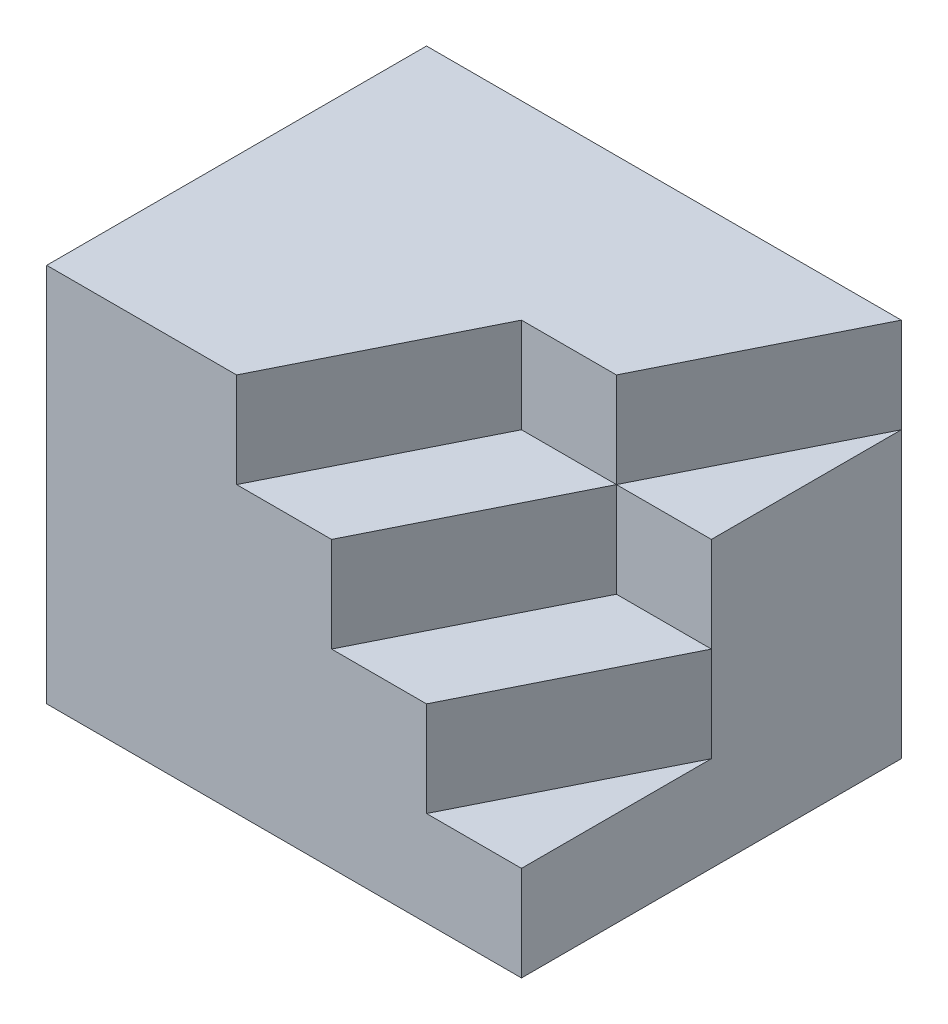
ISO-10303-21;
HEADER;
FILE_DESCRIPTION(('STEP AP214'),'2;1');
FILE_NAME('part.step','',(''),(''),'','','');
FILE_SCHEMA(('AUTOMOTIVE_DESIGN { 1 0 10303 214 1 1 1 1 }'));
ENDSEC;
DATA;
#1=APPLICATION_CONTEXT('core data for automotive mechanical design processes');
#2=APPLICATION_PROTOCOL_DEFINITION('international standard','automotive_design',2000,#1);
#3=PRODUCT_CONTEXT('',#1,'mechanical');
#4=PRODUCT('Part','Part','',(#3));
#5=PRODUCT_RELATED_PRODUCT_CATEGORY('part','',(#4));
#6=PRODUCT_DEFINITION_FORMATION('','',#4);
#7=PRODUCT_DEFINITION_CONTEXT('part definition',#1,'design');
#8=PRODUCT_DEFINITION('design','',#6,#7);
#9=PRODUCT_DEFINITION_SHAPE('','',#8);
#10=(LENGTH_UNIT() NAMED_UNIT(*) SI_UNIT(.MILLI.,.METRE.));
#11=(NAMED_UNIT(*) PLANE_ANGLE_UNIT() SI_UNIT($,.RADIAN.));
#12=(NAMED_UNIT(*) SI_UNIT($,.STERADIAN.) SOLID_ANGLE_UNIT());
#13=UNCERTAINTY_MEASURE_WITH_UNIT(LENGTH_MEASURE(1.E-05),#10,'distance_accuracy_value','');
#14=(GEOMETRIC_REPRESENTATION_CONTEXT(3) GLOBAL_UNCERTAINTY_ASSIGNED_CONTEXT((#13)) GLOBAL_UNIT_ASSIGNED_CONTEXT((#10,
#11,#12)) REPRESENTATION_CONTEXT('',''));
#15=CARTESIAN_POINT('',(0.,0.,0.));
#16=DIRECTION('',(0.,0.,1.));
#17=DIRECTION('',(1.,0.,0.));
#18=AXIS2_PLACEMENT_3D('',#15,#16,#17);
#19=CARTESIAN_POINT('',(12.,40.,6.));
#20=DIRECTION('',(-0.894427190999916,0.,-0.447213595499958));
#21=DIRECTION('',(-0.447213595499958,0.,0.894427190999916));
#22=AXIS2_PLACEMENT_3D('',#19,#20,#21);
#23=PLANE('',#22);
#24=DIRECTION('',(0.,-1.,0.));
#25=VECTOR('',#24,1.);
#26=CARTESIAN_POINT('',(5.,30.,20.));
#27=LINE('',#26,#25);
#28=CARTESIAN_POINT('',(5.,30.,20.));
#29=VERTEX_POINT('',#28);
#30=CARTESIAN_POINT('',(5.,20.,20.));
#31=VERTEX_POINT('',#30);
#32=EDGE_CURVE('E183',#29,#31,#27,.T.);
#33=ORIENTED_EDGE('',*,*,#32,.T.);
#34=DIRECTION('',(0.447213595499958,0.,-0.894427190999916));
#35=VECTOR('',#34,1.);
#36=CARTESIAN_POINT('',(12.,20.,6.));
#37=LINE('',#36,#35);
#38=CARTESIAN_POINT('',(15.,20.,0.));
#39=VERTEX_POINT('',#38);
#40=EDGE_CURVE('E147',#31,#39,#37,.T.);
#41=ORIENTED_EDGE('',*,*,#40,.T.);
#42=DIRECTION('',(0.,-1.,0.));
#43=VECTOR('',#42,1.);
#44=CARTESIAN_POINT('',(15.,30.,0.));
#45=LINE('',#44,#43);
#46=CARTESIAN_POINT('',(15.,30.,0.));
#47=VERTEX_POINT('',#46);
#48=EDGE_CURVE('E164',#47,#39,#45,.T.);
#49=ORIENTED_EDGE('',*,*,#48,.F.);
#50=DIRECTION('',(0.447213595499958,0.,-0.894427190999916));
#51=VECTOR('',#50,1.);
#52=CARTESIAN_POINT('',(12.,30.,6.));
#53=LINE('',#52,#51);
#54=EDGE_CURVE('E180',#29,#47,#53,.T.);
#55=ORIENTED_EDGE('',*,*,#54,.F.);
#56=EDGE_LOOP('',(#33,#41,#49,#55));
#57=FACE_BOUND('',#56,.T.);
#58=ADVANCED_FACE('F36',(#57),#23,.F.);
#59=CARTESIAN_POINT('',(4.,40.,2.));
#60=DIRECTION('',(0.894427190999916,0.,0.447213595499958));
#61=DIRECTION('',(0.447213595499958,0.,-0.894427190999916));
#62=AXIS2_PLACEMENT_3D('',#59,#60,#61);
#63=PLANE('',#62);
#64=DIRECTION('',(-0.447213595499958,0.,0.894427190999916));
#65=VECTOR('',#64,1.);
#66=CARTESIAN_POINT('',(4.,30.,2.));
#67=LINE('',#66,#65);
#68=CARTESIAN_POINT('',(5.,30.,0.));
#69=VERTEX_POINT('',#68);
#70=CARTESIAN_POINT('',(-5.,30.,20.));
#71=VERTEX_POINT('',#70);
#72=EDGE_CURVE('E175',#69,#71,#67,.T.);
#73=ORIENTED_EDGE('',*,*,#72,.F.);
#74=DIRECTION('',(0.,-1.,0.));
#75=VECTOR('',#74,1.);
#76=CARTESIAN_POINT('',(5.,40.,0.));
#77=LINE('',#76,#75);
#78=CARTESIAN_POINT('',(5.,40.,0.));
#79=VERTEX_POINT('',#78);
#80=EDGE_CURVE('E11',#79,#69,#77,.T.);
#81=ORIENTED_EDGE('',*,*,#80,.F.);
#82=DIRECTION('',(-0.447213595499958,0.,0.894427190999916));
#83=VECTOR('',#82,1.);
#84=CARTESIAN_POINT('',(4.,40.,2.));
#85=LINE('',#84,#83);
#86=CARTESIAN_POINT('',(-5.,40.,20.));
#87=VERTEX_POINT('',#86);
#88=EDGE_CURVE('E187',#79,#87,#85,.T.);
#89=ORIENTED_EDGE('',*,*,#88,.T.);
#90=DIRECTION('',(0.,-1.,0.));
#91=VECTOR('',#90,1.);
#92=CARTESIAN_POINT('',(-5.,40.,20.));
#93=LINE('',#92,#91);
#94=EDGE_CURVE('E203',#87,#71,#93,.T.);
#95=ORIENTED_EDGE('',*,*,#94,.T.);
#96=EDGE_LOOP('',(#73,#81,#89,#95));
#97=FACE_BOUND('',#96,.T.);
#98=ADVANCED_FACE('F38',(#97),#63,.T.);
#99=CARTESIAN_POINT('',(0.,40.,0.));
#100=DIRECTION('',(0.,0.,1.));
#101=DIRECTION('',(1.,0.,0.));
#102=AXIS2_PLACEMENT_3D('',#99,#100,#101);
#103=PLANE('',#102);
#104=DIRECTION('',(-1.,0.,0.));
#105=VECTOR('',#104,1.);
#106=CARTESIAN_POINT('',(0.,30.,0.));
#107=LINE('',#106,#105);
#108=EDGE_CURVE('E171',#47,#69,#107,.T.);
#109=ORIENTED_EDGE('',*,*,#108,.F.);
#110=DIRECTION('',(0.,-1.,0.));
#111=VECTOR('',#110,1.);
#112=CARTESIAN_POINT('',(15.,40.,0.));
#113=LINE('',#112,#111);
#114=CARTESIAN_POINT('',(15.,40.,0.));
#115=VERTEX_POINT('',#114);
#116=EDGE_CURVE('E44',#115,#47,#113,.T.);
#117=ORIENTED_EDGE('',*,*,#116,.F.);
#118=DIRECTION('',(-1.,0.,0.));
#119=VECTOR('',#118,1.);
#120=CARTESIAN_POINT('',(0.,40.,0.));
#121=LINE('',#120,#119);
#122=EDGE_CURVE('E190',#115,#79,#121,.T.);
#123=ORIENTED_EDGE('',*,*,#122,.T.);
#124=ORIENTED_EDGE('',*,*,#80,.T.);
#125=EDGE_LOOP('',(#109,#117,#123,#124));
#126=FACE_BOUND('',#125,.T.);
#127=ADVANCED_FACE('F244',(#126),#103,.T.);
#128=ORIENTED_EDGE('',*,*,#116,.T.);
#129=DIRECTION('',(0.447213595499958,0.,-0.894427190999916));
#130=VECTOR('',#129,1.);
#131=CARTESIAN_POINT('',(12.,30.,6.));
#132=LINE('',#131,#130);
#133=CARTESIAN_POINT('',(25.,30.,-20.));
#134=VERTEX_POINT('',#133);
#135=EDGE_CURVE('E158',#47,#134,#132,.T.);
#136=ORIENTED_EDGE('',*,*,#135,.T.);
#137=DIRECTION('',(0.,-1.,0.));
#138=VECTOR('',#137,1.);
#139=CARTESIAN_POINT('',(25.,40.,-20.));
#140=LINE('',#139,#138);
#141=CARTESIAN_POINT('',(25.,40.,-20.));
#142=VERTEX_POINT('',#141);
#143=EDGE_CURVE('E216',#142,#134,#140,.T.);
#144=ORIENTED_EDGE('',*,*,#143,.F.);
#145=DIRECTION('',(0.447213595499958,0.,-0.894427190999916));
#146=VECTOR('',#145,1.);
#147=CARTESIAN_POINT('',(12.,40.,6.));
#148=LINE('',#147,#146);
#149=EDGE_CURVE('E193',#115,#142,#148,.T.);
#150=ORIENTED_EDGE('',*,*,#149,.F.);
#151=EDGE_LOOP('',(#128,#136,#144,#150));
#152=FACE_BOUND('',#151,.T.);
#153=ADVANCED_FACE('F221',(#152),#23,.F.);
#154=CARTESIAN_POINT('',(0.,40.,-20.));
#155=DIRECTION('',(0.,0.,1.));
#156=DIRECTION('',(1.,0.,0.));
#157=AXIS2_PLACEMENT_3D('',#154,#155,#156);
#158=PLANE('',#157);
#159=DIRECTION('',(-1.,0.,0.));
#160=VECTOR('',#159,1.);
#161=CARTESIAN_POINT('',(0.,0.,-20.));
#162=LINE('',#161,#160);
#163=CARTESIAN_POINT('',(25.,0.,-20.));
#164=VERTEX_POINT('',#163);
#165=CARTESIAN_POINT('',(-25.,0.,-20.));
#166=VERTEX_POINT('',#165);
#167=EDGE_CURVE('E186',#164,#166,#162,.T.);
#168=ORIENTED_EDGE('',*,*,#167,.T.);
#169=DIRECTION('',(0.,-1.,0.));
#170=VECTOR('',#169,1.);
#171=CARTESIAN_POINT('',(-25.,40.,-20.));
#172=LINE('',#171,#170);
#173=CARTESIAN_POINT('',(-25.,40.,-20.));
#174=VERTEX_POINT('',#173);
#175=EDGE_CURVE('E214',#174,#166,#172,.T.);
#176=ORIENTED_EDGE('',*,*,#175,.F.);
#177=DIRECTION('',(-1.,0.,0.));
#178=VECTOR('',#177,1.);
#179=CARTESIAN_POINT('',(0.,40.,-20.));
#180=LINE('',#179,#178);
#181=EDGE_CURVE('E195',#142,#174,#180,.T.);
#182=ORIENTED_EDGE('',*,*,#181,.F.);
#183=ORIENTED_EDGE('',*,*,#143,.T.);
#184=DIRECTION('',(0.,-1.,0.));
#185=VECTOR('',#184,1.);
#186=CARTESIAN_POINT('',(25.,30.,-20.));
#187=LINE('',#186,#185);
#188=EDGE_CURVE('E160',#134,#164,#187,.T.);
#189=ORIENTED_EDGE('',*,*,#188,.T.);
#190=EDGE_LOOP('',(#168,#176,#182,#183,#189));
#191=FACE_BOUND('',#190,.T.);
#192=ADVANCED_FACE('F236',(#191),#158,.F.);
#193=CARTESIAN_POINT('',(-25.,40.,0.));
#194=DIRECTION('',(-1.,0.,0.));
#195=DIRECTION('',(0.,0.,1.));
#196=AXIS2_PLACEMENT_3D('',#193,#194,#195);
#197=PLANE('',#196);
#198=DIRECTION('',(0.,0.,-1.));
#199=VECTOR('',#198,1.);
#200=CARTESIAN_POINT('',(-25.,0.,0.));
#201=LINE('',#200,#199);
#202=CARTESIAN_POINT('',(-25.,0.,20.));
#203=VERTEX_POINT('',#202);
#204=EDGE_CURVE('E206',#203,#166,#201,.T.);
#205=ORIENTED_EDGE('',*,*,#204,.F.);
#206=DIRECTION('',(0.,-1.,0.));
#207=VECTOR('',#206,1.);
#208=CARTESIAN_POINT('',(-25.,40.,20.));
#209=LINE('',#208,#207);
#210=CARTESIAN_POINT('',(-25.,40.,20.));
#211=VERTEX_POINT('',#210);
#212=EDGE_CURVE('E212',#211,#203,#209,.T.);
#213=ORIENTED_EDGE('',*,*,#212,.F.);
#214=DIRECTION('',(0.,0.,-1.));
#215=VECTOR('',#214,1.);
#216=CARTESIAN_POINT('',(-25.,40.,0.));
#217=LINE('',#216,#215);
#218=EDGE_CURVE('E197',#211,#174,#217,.T.);
#219=ORIENTED_EDGE('',*,*,#218,.T.);
#220=ORIENTED_EDGE('',*,*,#175,.T.);
#221=EDGE_LOOP('',(#205,#213,#219,#220));
#222=FACE_BOUND('',#221,.T.);
#223=ADVANCED_FACE('F276',(#222),#197,.T.);
#224=CARTESIAN_POINT('',(0.,40.,20.));
#225=DIRECTION('',(0.,0.,1.));
#226=DIRECTION('',(1.,0.,0.));
#227=AXIS2_PLACEMENT_3D('',#224,#225,#226);
#228=PLANE('',#227);
#229=DIRECTION('',(-1.,0.,0.));
#230=VECTOR('',#229,1.);
#231=CARTESIAN_POINT('',(0.,0.,20.));
#232=LINE('',#231,#230);
#233=CARTESIAN_POINT('',(25.,0.,20.));
#234=VERTEX_POINT('',#233);
#235=EDGE_CURVE('E127',#234,#203,#232,.T.);
#236=ORIENTED_EDGE('',*,*,#235,.F.);
#237=DIRECTION('',(0.,-1.,0.));
#238=VECTOR('',#237,1.);
#239=CARTESIAN_POINT('',(25.,10.,20.));
#240=LINE('',#239,#238);
#241=CARTESIAN_POINT('',(25.,10.,20.));
#242=VERTEX_POINT('',#241);
#243=EDGE_CURVE('E121',#242,#234,#240,.T.);
#244=ORIENTED_EDGE('',*,*,#243,.F.);
#245=DIRECTION('',(-1.,0.,0.));
#246=VECTOR('',#245,1.);
#247=CARTESIAN_POINT('',(0.,10.,20.));
#248=LINE('',#247,#246);
#249=CARTESIAN_POINT('',(15.,10.,20.));
#250=VERTEX_POINT('',#249);
#251=EDGE_CURVE('E125',#242,#250,#248,.T.);
#252=ORIENTED_EDGE('',*,*,#251,.T.);
#253=DIRECTION('',(0.,-1.,0.));
#254=VECTOR('',#253,1.);
#255=CARTESIAN_POINT('',(15.,20.,20.));
#256=LINE('',#255,#254);
#257=CARTESIAN_POINT('',(15.,20.,20.));
#258=VERTEX_POINT('',#257);
#259=EDGE_CURVE('E51',#258,#250,#256,.T.);
#260=ORIENTED_EDGE('',*,*,#259,.F.);
#261=DIRECTION('',(-1.,0.,0.));
#262=VECTOR('',#261,1.);
#263=CARTESIAN_POINT('',(0.,20.,20.));
#264=LINE('',#263,#262);
#265=EDGE_CURVE('E150',#258,#31,#264,.T.);
#266=ORIENTED_EDGE('',*,*,#265,.T.);
#267=ORIENTED_EDGE('',*,*,#32,.F.);
#268=DIRECTION('',(-1.,0.,0.));
#269=VECTOR('',#268,1.);
#270=CARTESIAN_POINT('',(0.,30.,20.));
#271=LINE('',#270,#269);
#272=EDGE_CURVE('E177',#29,#71,#271,.T.);
#273=ORIENTED_EDGE('',*,*,#272,.T.);
#274=ORIENTED_EDGE('',*,*,#94,.F.);
#275=DIRECTION('',(-1.,0.,0.));
#276=VECTOR('',#275,1.);
#277=CARTESIAN_POINT('',(0.,40.,20.));
#278=LINE('',#277,#276);
#279=EDGE_CURVE('E200',#87,#211,#278,.T.);
#280=ORIENTED_EDGE('',*,*,#279,.T.);
#281=ORIENTED_EDGE('',*,*,#212,.T.);
#282=EDGE_LOOP('',(#236,#244,#252,#260,#266,#267,#273,#274,#280,#281));
#283=FACE_BOUND('',#282,.T.);
#284=ADVANCED_FACE('F123',(#283),#228,.T.);
#285=CARTESIAN_POINT('',(0.,40.,0.));
#286=DIRECTION('',(0.,1.,0.));
#287=DIRECTION('',(0.,0.,1.));
#288=AXIS2_PLACEMENT_3D('',#285,#286,#287);
#289=PLANE('',#288);
#290=ORIENTED_EDGE('',*,*,#88,.F.);
#291=ORIENTED_EDGE('',*,*,#122,.F.);
#292=ORIENTED_EDGE('',*,*,#149,.T.);
#293=ORIENTED_EDGE('',*,*,#181,.T.);
#294=ORIENTED_EDGE('',*,*,#218,.F.);
#295=ORIENTED_EDGE('',*,*,#279,.F.);
#296=EDGE_LOOP('',(#290,#291,#292,#293,#294,#295));
#297=FACE_BOUND('',#296,.T.);
#298=ADVANCED_FACE('F242',(#297),#289,.T.);
#299=CARTESIAN_POINT('',(0.,0.,0.));
#300=DIRECTION('',(0.,1.,0.));
#301=DIRECTION('',(0.,0.,1.));
#302=AXIS2_PLACEMENT_3D('',#299,#300,#301);
#303=PLANE('',#302);
#304=DIRECTION('',(0.,0.,-1.));
#305=VECTOR('',#304,1.);
#306=CARTESIAN_POINT('',(25.,0.,0.));
#307=LINE('',#306,#305);
#308=EDGE_CURVE('E159',#234,#164,#307,.T.);
#309=ORIENTED_EDGE('',*,*,#308,.F.);
#310=ORIENTED_EDGE('',*,*,#235,.T.);
#311=ORIENTED_EDGE('',*,*,#204,.T.);
#312=ORIENTED_EDGE('',*,*,#167,.F.);
#313=EDGE_LOOP('',(#309,#310,#311,#312));
#314=FACE_BOUND('',#313,.T.);
#315=ADVANCED_FACE('F292',(#314),#303,.F.);
#316=CARTESIAN_POINT('',(0.,30.,0.));
#317=DIRECTION('',(0.,1.,0.));
#318=DIRECTION('',(0.,0.,1.));
#319=AXIS2_PLACEMENT_3D('',#316,#317,#318);
#320=PLANE('',#319);
#321=ORIENTED_EDGE('',*,*,#108,.T.);
#322=ORIENTED_EDGE('',*,*,#72,.T.);
#323=ORIENTED_EDGE('',*,*,#272,.F.);
#324=ORIENTED_EDGE('',*,*,#54,.T.);
#325=EDGE_LOOP('',(#321,#322,#323,#324));
#326=FACE_BOUND('',#325,.T.);
#327=ADVANCED_FACE('F249',(#326),#320,.T.);
#328=CARTESIAN_POINT('',(0.,30.,0.));
#329=DIRECTION('',(0.,0.,1.));
#330=DIRECTION('',(1.,0.,0.));
#331=AXIS2_PLACEMENT_3D('',#328,#329,#330);
#332=PLANE('',#331);
#333=DIRECTION('',(-1.,0.,0.));
#334=VECTOR('',#333,1.);
#335=CARTESIAN_POINT('',(0.,20.,0.));
#336=LINE('',#335,#334);
#337=CARTESIAN_POINT('',(25.,20.,0.));
#338=VERTEX_POINT('',#337);
#339=EDGE_CURVE('E145',#338,#39,#336,.T.);
#340=ORIENTED_EDGE('',*,*,#339,.F.);
#341=DIRECTION('',(0.,-1.,0.));
#342=VECTOR('',#341,1.);
#343=CARTESIAN_POINT('',(25.,30.,0.));
#344=LINE('',#343,#342);
#345=CARTESIAN_POINT('',(25.,30.,0.));
#346=VERTEX_POINT('',#345);
#347=EDGE_CURVE('E156',#346,#338,#344,.T.);
#348=ORIENTED_EDGE('',*,*,#347,.F.);
#349=DIRECTION('',(-1.,0.,0.));
#350=VECTOR('',#349,1.);
#351=CARTESIAN_POINT('',(0.,30.,0.));
#352=LINE('',#351,#350);
#353=EDGE_CURVE('E155',#346,#47,#352,.T.);
#354=ORIENTED_EDGE('',*,*,#353,.T.);
#355=ORIENTED_EDGE('',*,*,#48,.T.);
#356=EDGE_LOOP('',(#340,#348,#354,#355));
#357=FACE_BOUND('',#356,.T.);
#358=ADVANCED_FACE('F230',(#357),#332,.T.);
#359=CARTESIAN_POINT('',(25.,30.,0.));
#360=DIRECTION('',(-1.,0.,0.));
#361=DIRECTION('',(0.,0.,1.));
#362=AXIS2_PLACEMENT_3D('',#359,#360,#361);
#363=PLANE('',#362);
#364=ORIENTED_EDGE('',*,*,#308,.T.);
#365=ORIENTED_EDGE('',*,*,#188,.F.);
#366=DIRECTION('',(0.,0.,-1.));
#367=VECTOR('',#366,1.);
#368=CARTESIAN_POINT('',(25.,30.,0.));
#369=LINE('',#368,#367);
#370=EDGE_CURVE('E163',#346,#134,#369,.T.);
#371=ORIENTED_EDGE('',*,*,#370,.F.);
#372=ORIENTED_EDGE('',*,*,#347,.T.);
#373=DIRECTION('',(0.,-1.,0.));
#374=VECTOR('',#373,1.);
#375=CARTESIAN_POINT('',(25.,20.,0.));
#376=LINE('',#375,#374);
#377=CARTESIAN_POINT('',(25.,10.,0.));
#378=VERTEX_POINT('',#377);
#379=EDGE_CURVE('E137',#338,#378,#376,.T.);
#380=ORIENTED_EDGE('',*,*,#379,.T.);
#381=DIRECTION('',(0.,0.,-1.));
#382=VECTOR('',#381,1.);
#383=CARTESIAN_POINT('',(25.,10.,0.));
#384=LINE('',#383,#382);
#385=EDGE_CURVE('E132',#242,#378,#384,.T.);
#386=ORIENTED_EDGE('',*,*,#385,.F.);
#387=ORIENTED_EDGE('',*,*,#243,.T.);
#388=EDGE_LOOP('',(#364,#365,#371,#372,#380,#386,#387));
#389=FACE_BOUND('',#388,.T.);
#390=ADVANCED_FACE('F135',(#389),#363,.F.);
#391=CARTESIAN_POINT('',(0.,30.,0.));
#392=DIRECTION('',(0.,1.,0.));
#393=DIRECTION('',(0.,0.,1.));
#394=AXIS2_PLACEMENT_3D('',#391,#392,#393);
#395=PLANE('',#394);
#396=ORIENTED_EDGE('',*,*,#353,.F.);
#397=ORIENTED_EDGE('',*,*,#370,.T.);
#398=ORIENTED_EDGE('',*,*,#135,.F.);
#399=EDGE_LOOP('',(#396,#397,#398));
#400=FACE_BOUND('',#399,.T.);
#401=ADVANCED_FACE('F233',(#400),#395,.T.);
#402=CARTESIAN_POINT('',(20.,20.,10.));
#403=DIRECTION('',(-0.894427190999916,0.,-0.447213595499958));
#404=DIRECTION('',(-0.447213595499958,0.,0.894427190999916));
#405=AXIS2_PLACEMENT_3D('',#402,#403,#404);
#406=PLANE('',#405);
#407=ORIENTED_EDGE('',*,*,#259,.T.);
#408=DIRECTION('',(0.447213595499958,0.,-0.894427190999916));
#409=VECTOR('',#408,1.);
#410=CARTESIAN_POINT('',(20.,10.,10.));
#411=LINE('',#410,#409);
#412=EDGE_CURVE('E55',#250,#378,#411,.T.);
#413=ORIENTED_EDGE('',*,*,#412,.T.);
#414=ORIENTED_EDGE('',*,*,#379,.F.);
#415=DIRECTION('',(0.447213595499958,0.,-0.894427190999916));
#416=VECTOR('',#415,1.);
#417=CARTESIAN_POINT('',(20.,20.,10.));
#418=LINE('',#417,#416);
#419=EDGE_CURVE('E131',#258,#338,#418,.T.);
#420=ORIENTED_EDGE('',*,*,#419,.F.);
#421=EDGE_LOOP('',(#407,#413,#414,#420));
#422=FACE_BOUND('',#421,.T.);
#423=ADVANCED_FACE('F255',(#422),#406,.F.);
#424=CARTESIAN_POINT('',(0.,20.,0.));
#425=DIRECTION('',(0.,1.,0.));
#426=DIRECTION('',(0.,0.,1.));
#427=AXIS2_PLACEMENT_3D('',#424,#425,#426);
#428=PLANE('',#427);
#429=ORIENTED_EDGE('',*,*,#419,.T.);
#430=ORIENTED_EDGE('',*,*,#339,.T.);
#431=ORIENTED_EDGE('',*,*,#40,.F.);
#432=ORIENTED_EDGE('',*,*,#265,.F.);
#433=EDGE_LOOP('',(#429,#430,#431,#432));
#434=FACE_BOUND('',#433,.T.);
#435=ADVANCED_FACE('F254',(#434),#428,.T.);
#436=CARTESIAN_POINT('',(0.,10.,0.));
#437=DIRECTION('',(0.,1.,0.));
#438=DIRECTION('',(0.,0.,1.));
#439=AXIS2_PLACEMENT_3D('',#436,#437,#438);
#440=PLANE('',#439);
#441=ORIENTED_EDGE('',*,*,#412,.F.);
#442=ORIENTED_EDGE('',*,*,#251,.F.);
#443=ORIENTED_EDGE('',*,*,#385,.T.);
#444=EDGE_LOOP('',(#441,#442,#443));
#445=FACE_BOUND('',#444,.T.);
#446=ADVANCED_FACE('F140',(#445),#440,.T.);
#447=CLOSED_SHELL('',(#58,#98,#127,#153,#192,#223,#284,#298,#315,#327,#358,#390,#401,#423,#435,#446));
#448=MANIFOLD_SOLID_BREP('B2',#447);
#449=ADVANCED_BREP_SHAPE_REPRESENTATION('',(#18,#448),#14);
#450=SHAPE_DEFINITION_REPRESENTATION(#9,#449);
ENDSEC;
END-ISO-10303-21;
